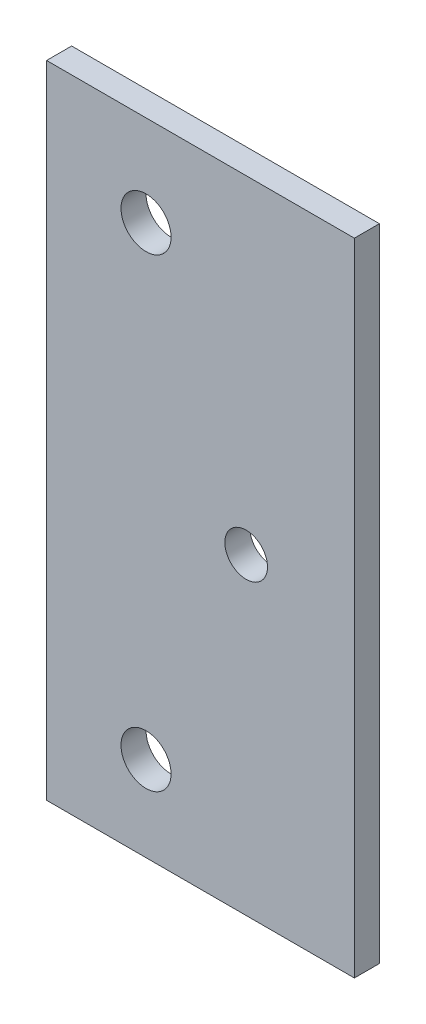
ISO-10303-21;
HEADER;
FILE_DESCRIPTION(('STEP AP214'),'2;1');
FILE_NAME('part.step','',(''),(''),'','','');
FILE_SCHEMA(('AUTOMOTIVE_DESIGN { 1 0 10303 214 1 1 1 1 }'));
ENDSEC;
DATA;
#1=APPLICATION_CONTEXT('core data for automotive mechanical design processes');
#2=APPLICATION_PROTOCOL_DEFINITION('international standard','automotive_design',2000,#1);
#3=PRODUCT_CONTEXT('',#1,'mechanical');
#4=PRODUCT('Part','Part','',(#3));
#5=PRODUCT_RELATED_PRODUCT_CATEGORY('part','',(#4));
#6=PRODUCT_DEFINITION_FORMATION('','',#4);
#7=PRODUCT_DEFINITION_CONTEXT('part definition',#1,'design');
#8=PRODUCT_DEFINITION('design','',#6,#7);
#9=PRODUCT_DEFINITION_SHAPE('','',#8);
#10=(LENGTH_UNIT() NAMED_UNIT(*) SI_UNIT(.MILLI.,.METRE.));
#11=(NAMED_UNIT(*) PLANE_ANGLE_UNIT() SI_UNIT($,.RADIAN.));
#12=(NAMED_UNIT(*) SI_UNIT($,.STERADIAN.) SOLID_ANGLE_UNIT());
#13=UNCERTAINTY_MEASURE_WITH_UNIT(LENGTH_MEASURE(1.E-05),#10,'distance_accuracy_value','');
#14=(GEOMETRIC_REPRESENTATION_CONTEXT(3) GLOBAL_UNCERTAINTY_ASSIGNED_CONTEXT((#13)) GLOBAL_UNIT_ASSIGNED_CONTEXT((#10,
#11,#12)) REPRESENTATION_CONTEXT('',''));
#15=CARTESIAN_POINT('',(0.,0.,0.));
#16=DIRECTION('',(0.,0.,1.));
#17=DIRECTION('',(1.,0.,0.));
#18=AXIS2_PLACEMENT_3D('',#15,#16,#17);
#19=CARTESIAN_POINT('',(0.,0.,3.175));
#20=DIRECTION('',(0.,0.,1.));
#21=DIRECTION('',(1.,0.,0.));
#22=AXIS2_PLACEMENT_3D('',#19,#20,#21);
#23=PLANE('',#22);
#24=CARTESIAN_POINT('',(-63.5,205.74,3.175));
#25=DIRECTION('',(0.,0.,1.));
#26=DIRECTION('',(1.,0.,0.));
#27=AXIS2_PLACEMENT_3D('',#24,#25,#26);
#28=CIRCLE('',#27,2.70509999999999);
#29=CARTESIAN_POINT('',(-60.7949,205.74,3.175));
#30=VERTEX_POINT('',#29);
#31=EDGE_CURVE('E132',#30,#30,#28,.T.);
#32=ORIENTED_EDGE('',*,*,#31,.F.);
#33=EDGE_LOOP('',(#32));
#34=FACE_BOUND('',#33,.T.);
#35=CARTESIAN_POINT('',(-76.2000000000008,235.857142857143,3.175));
#36=DIRECTION('',(0.,0.,1.));
#37=DIRECTION('',(1.,0.,0.));
#38=AXIS2_PLACEMENT_3D('',#35,#36,#37);
#39=CIRCLE('',#38,3.17499999999998);
#40=CARTESIAN_POINT('',(-73.0250000000008,235.857142857143,3.175));
#41=VERTEX_POINT('',#40);
#42=EDGE_CURVE('E106',#41,#41,#39,.T.);
#43=ORIENTED_EDGE('',*,*,#42,.F.);
#44=EDGE_LOOP('',(#43));
#45=FACE_BOUND('',#44,.T.);
#46=DIRECTION('',(0.,-1.,0.));
#47=VECTOR('',#46,1.);
#48=CARTESIAN_POINT('',(-88.810165052237,247.372490547668,3.175));
#49=LINE('',#48,#47);
#50=CARTESIAN_POINT('',(-88.810165052237,247.372490547668,3.175));
#51=VERTEX_POINT('',#50);
#52=CARTESIAN_POINT('',(-88.810165052237,166.113152374558,3.175));
#53=VERTEX_POINT('',#52);
#54=EDGE_CURVE('E91',#51,#53,#49,.T.);
#55=ORIENTED_EDGE('',*,*,#54,.T.);
#56=DIRECTION('',(1.,0.,0.));
#57=VECTOR('',#56,1.);
#58=CARTESIAN_POINT('',(-88.810165052237,166.113152374558,3.175));
#59=LINE('',#58,#57);
#60=CARTESIAN_POINT('',(-49.7778299400401,166.113152374558,3.175));
#61=VERTEX_POINT('',#60);
#62=EDGE_CURVE('E86',#53,#61,#59,.T.);
#63=ORIENTED_EDGE('',*,*,#62,.T.);
#64=DIRECTION('',(0.,1.,0.));
#65=VECTOR('',#64,1.);
#66=CARTESIAN_POINT('',(-49.7778299400401,247.372490547668,3.175));
#67=LINE('',#66,#65);
#68=CARTESIAN_POINT('',(-49.7778299400401,247.372490547668,3.175));
#69=VERTEX_POINT('',#68);
#70=EDGE_CURVE('E89',#61,#69,#67,.T.);
#71=ORIENTED_EDGE('',*,*,#70,.T.);
#72=DIRECTION('',(-1.,0.,0.));
#73=VECTOR('',#72,1.);
#74=CARTESIAN_POINT('',(-88.810165052237,247.372490547668,3.175));
#75=LINE('',#74,#73);
#76=EDGE_CURVE('E56',#69,#51,#75,.T.);
#77=ORIENTED_EDGE('',*,*,#76,.T.);
#78=EDGE_LOOP('',(#55,#63,#71,#77));
#79=FACE_BOUND('',#78,.T.);
#80=CARTESIAN_POINT('',(-76.2000000000006,176.892857142857,3.175));
#81=DIRECTION('',(0.,0.,1.));
#82=DIRECTION('',(1.,0.,0.));
#83=AXIS2_PLACEMENT_3D('',#80,#81,#82);
#84=CIRCLE('',#83,3.17499999999998);
#85=CARTESIAN_POINT('',(-73.0250000000006,176.892857142857,3.175));
#86=VERTEX_POINT('',#85);
#87=EDGE_CURVE('E121',#86,#86,#84,.T.);
#88=ORIENTED_EDGE('',*,*,#87,.F.);
#89=EDGE_LOOP('',(#88));
#90=FACE_BOUND('',#89,.T.);
#91=ADVANCED_FACE('F39',(#34,#45,#79,#90),#23,.T.);
#92=CARTESIAN_POINT('',(0.,0.,0.));
#93=DIRECTION('',(0.,0.,1.));
#94=DIRECTION('',(1.,0.,0.));
#95=AXIS2_PLACEMENT_3D('',#92,#93,#94);
#96=PLANE('',#95);
#97=CARTESIAN_POINT('',(-63.5,205.74,0.));
#98=DIRECTION('',(0.,0.,1.));
#99=DIRECTION('',(1.,0.,0.));
#100=AXIS2_PLACEMENT_3D('',#97,#98,#99);
#101=CIRCLE('',#100,2.7051);
#102=CARTESIAN_POINT('',(-60.7949,205.74,0.));
#103=VERTEX_POINT('',#102);
#104=EDGE_CURVE('E127',#103,#103,#101,.T.);
#105=ORIENTED_EDGE('',*,*,#104,.T.);
#106=EDGE_LOOP('',(#105));
#107=FACE_BOUND('',#106,.T.);
#108=DIRECTION('',(0.,-1.,0.));
#109=VECTOR('',#108,1.);
#110=CARTESIAN_POINT('',(-88.810165052237,247.372490547668,0.));
#111=LINE('',#110,#109);
#112=CARTESIAN_POINT('',(-88.810165052237,247.372490547668,0.));
#113=VERTEX_POINT('',#112);
#114=CARTESIAN_POINT('',(-88.810165052237,166.113152374558,0.));
#115=VERTEX_POINT('',#114);
#116=EDGE_CURVE('E103',#113,#115,#111,.T.);
#117=ORIENTED_EDGE('',*,*,#116,.F.);
#118=DIRECTION('',(-1.,0.,0.));
#119=VECTOR('',#118,1.);
#120=CARTESIAN_POINT('',(-88.810165052237,247.372490547668,0.));
#121=LINE('',#120,#119);
#122=CARTESIAN_POINT('',(-49.7778299400401,247.372490547668,0.));
#123=VERTEX_POINT('',#122);
#124=EDGE_CURVE('E79',#123,#113,#121,.T.);
#125=ORIENTED_EDGE('',*,*,#124,.F.);
#126=DIRECTION('',(0.,1.,0.));
#127=VECTOR('',#126,1.);
#128=CARTESIAN_POINT('',(-49.7778299400401,247.372490547668,0.));
#129=LINE('',#128,#127);
#130=CARTESIAN_POINT('',(-49.7778299400401,166.113152374558,0.));
#131=VERTEX_POINT('',#130);
#132=EDGE_CURVE('E73',#131,#123,#129,.T.);
#133=ORIENTED_EDGE('',*,*,#132,.F.);
#134=DIRECTION('',(1.,0.,0.));
#135=VECTOR('',#134,1.);
#136=CARTESIAN_POINT('',(-88.810165052237,166.113152374558,0.));
#137=LINE('',#136,#135);
#138=EDGE_CURVE('E95',#115,#131,#137,.T.);
#139=ORIENTED_EDGE('',*,*,#138,.F.);
#140=EDGE_LOOP('',(#117,#125,#133,#139));
#141=FACE_BOUND('',#140,.T.);
#142=CARTESIAN_POINT('',(-76.2000000000008,235.857142857143,0.));
#143=DIRECTION('',(0.,0.,1.));
#144=DIRECTION('',(1.,0.,0.));
#145=AXIS2_PLACEMENT_3D('',#142,#143,#144);
#146=CIRCLE('',#145,3.17499999999998);
#147=CARTESIAN_POINT('',(-73.0250000000008,235.857142857143,0.));
#148=VERTEX_POINT('',#147);
#149=EDGE_CURVE('E118',#148,#148,#146,.T.);
#150=ORIENTED_EDGE('',*,*,#149,.T.);
#151=EDGE_LOOP('',(#150));
#152=FACE_BOUND('',#151,.T.);
#153=CARTESIAN_POINT('',(-76.2000000000006,176.892857142857,0.));
#154=DIRECTION('',(0.,0.,1.));
#155=DIRECTION('',(1.,0.,0.));
#156=AXIS2_PLACEMENT_3D('',#153,#154,#155);
#157=CIRCLE('',#156,3.17499999999998);
#158=CARTESIAN_POINT('',(-73.0250000000006,176.892857142857,0.));
#159=VERTEX_POINT('',#158);
#160=EDGE_CURVE('E124',#159,#159,#157,.T.);
#161=ORIENTED_EDGE('',*,*,#160,.T.);
#162=EDGE_LOOP('',(#161));
#163=FACE_BOUND('',#162,.T.);
#164=ADVANCED_FACE('F114',(#107,#141,#152,#163),#96,.F.);
#165=CARTESIAN_POINT('',(-88.810165052237,247.372490547668,3.175));
#166=DIRECTION('',(1.,0.,0.));
#167=DIRECTION('',(0.,0.,-1.));
#168=AXIS2_PLACEMENT_3D('',#165,#166,#167);
#169=PLANE('',#168);
#170=ORIENTED_EDGE('',*,*,#116,.T.);
#171=DIRECTION('',(0.,0.,-1.));
#172=VECTOR('',#171,1.);
#173=CARTESIAN_POINT('',(-88.810165052237,166.113152374558,3.175));
#174=LINE('',#173,#172);
#175=EDGE_CURVE('E11',#53,#115,#174,.T.);
#176=ORIENTED_EDGE('',*,*,#175,.F.);
#177=ORIENTED_EDGE('',*,*,#54,.F.);
#178=DIRECTION('',(0.,0.,-1.));
#179=VECTOR('',#178,1.);
#180=CARTESIAN_POINT('',(-88.810165052237,247.372490547668,3.175));
#181=LINE('',#180,#179);
#182=EDGE_CURVE('E99',#51,#113,#181,.T.);
#183=ORIENTED_EDGE('',*,*,#182,.T.);
#184=EDGE_LOOP('',(#170,#176,#177,#183));
#185=FACE_BOUND('',#184,.T.);
#186=ADVANCED_FACE('F41',(#185),#169,.F.);
#187=CARTESIAN_POINT('',(-88.810165052237,166.113152374558,3.175));
#188=DIRECTION('',(0.,1.,0.));
#189=DIRECTION('',(0.,0.,1.));
#190=AXIS2_PLACEMENT_3D('',#187,#188,#189);
#191=PLANE('',#190);
#192=ORIENTED_EDGE('',*,*,#138,.T.);
#193=DIRECTION('',(0.,0.,-1.));
#194=VECTOR('',#193,1.);
#195=CARTESIAN_POINT('',(-49.7778299400401,166.113152374558,3.175));
#196=LINE('',#195,#194);
#197=EDGE_CURVE('E48',#61,#131,#196,.T.);
#198=ORIENTED_EDGE('',*,*,#197,.F.);
#199=ORIENTED_EDGE('',*,*,#62,.F.);
#200=ORIENTED_EDGE('',*,*,#175,.T.);
#201=EDGE_LOOP('',(#192,#198,#199,#200));
#202=FACE_BOUND('',#201,.T.);
#203=ADVANCED_FACE('F94',(#202),#191,.F.);
#204=CARTESIAN_POINT('',(-49.7778299400401,247.372490547668,3.175));
#205=DIRECTION('',(-1.,0.,0.));
#206=DIRECTION('',(0.,0.,1.));
#207=AXIS2_PLACEMENT_3D('',#204,#205,#206);
#208=PLANE('',#207);
#209=ORIENTED_EDGE('',*,*,#132,.T.);
#210=DIRECTION('',(0.,0.,-1.));
#211=VECTOR('',#210,1.);
#212=CARTESIAN_POINT('',(-49.7778299400401,247.372490547668,3.175));
#213=LINE('',#212,#211);
#214=EDGE_CURVE('E96',#69,#123,#213,.T.);
#215=ORIENTED_EDGE('',*,*,#214,.F.);
#216=ORIENTED_EDGE('',*,*,#70,.F.);
#217=ORIENTED_EDGE('',*,*,#197,.T.);
#218=EDGE_LOOP('',(#209,#215,#216,#217));
#219=FACE_BOUND('',#218,.T.);
#220=ADVANCED_FACE('F97',(#219),#208,.F.);
#221=CARTESIAN_POINT('',(-88.810165052237,247.372490547668,3.175));
#222=DIRECTION('',(0.,-1.,0.));
#223=DIRECTION('',(0.,0.,-1.));
#224=AXIS2_PLACEMENT_3D('',#221,#222,#223);
#225=PLANE('',#224);
#226=ORIENTED_EDGE('',*,*,#124,.T.);
#227=ORIENTED_EDGE('',*,*,#182,.F.);
#228=ORIENTED_EDGE('',*,*,#76,.F.);
#229=ORIENTED_EDGE('',*,*,#214,.T.);
#230=EDGE_LOOP('',(#226,#227,#228,#229));
#231=FACE_BOUND('',#230,.T.);
#232=ADVANCED_FACE('F111',(#231),#225,.F.);
#233=CARTESIAN_POINT('',(-76.2000000000008,235.857142857143,3.175));
#234=DIRECTION('',(0.,0.,-1.));
#235=DIRECTION('',(-1.,0.,0.));
#236=AXIS2_PLACEMENT_3D('',#233,#234,#235);
#237=CYLINDRICAL_SURFACE('',#236,3.17499999999998);
#238=ORIENTED_EDGE('',*,*,#42,.T.);
#239=EDGE_LOOP('',(#238));
#240=FACE_BOUND('',#239,.T.);
#241=ORIENTED_EDGE('',*,*,#149,.F.);
#242=EDGE_LOOP('',(#241));
#243=FACE_BOUND('',#242,.T.);
#244=ADVANCED_FACE('F143',(#240,#243),#237,.F.);
#245=CARTESIAN_POINT('',(-76.2000000000006,176.892857142857,3.175));
#246=DIRECTION('',(0.,0.,-1.));
#247=DIRECTION('',(-1.,0.,0.));
#248=AXIS2_PLACEMENT_3D('',#245,#246,#247);
#249=CYLINDRICAL_SURFACE('',#248,3.17499999999998);
#250=ORIENTED_EDGE('',*,*,#87,.T.);
#251=EDGE_LOOP('',(#250));
#252=FACE_BOUND('',#251,.T.);
#253=ORIENTED_EDGE('',*,*,#160,.F.);
#254=EDGE_LOOP('',(#253));
#255=FACE_BOUND('',#254,.T.);
#256=ADVANCED_FACE('F146',(#252,#255),#249,.F.);
#257=CARTESIAN_POINT('',(-63.5,205.74,3.175));
#258=DIRECTION('',(0.,0.,1.));
#259=DIRECTION('',(1.,0.,0.));
#260=AXIS2_PLACEMENT_3D('',#257,#258,#259);
#261=CYLINDRICAL_SURFACE('',#260,2.70509999999999);
#262=ORIENTED_EDGE('',*,*,#104,.F.);
#263=EDGE_LOOP('',(#262));
#264=FACE_BOUND('',#263,.T.);
#265=ORIENTED_EDGE('',*,*,#31,.T.);
#266=EDGE_LOOP('',(#265));
#267=FACE_BOUND('',#266,.T.);
#268=ADVANCED_FACE('F136',(#264,#267),#261,.F.);
#269=CLOSED_SHELL('',(#91,#164,#186,#203,#220,#232,#244,#256,#268));
#270=MANIFOLD_SOLID_BREP('B2',#269);
#271=ADVANCED_BREP_SHAPE_REPRESENTATION('',(#18,#270),#14);
#272=SHAPE_DEFINITION_REPRESENTATION(#9,#271);
ENDSEC;
END-ISO-10303-21;
